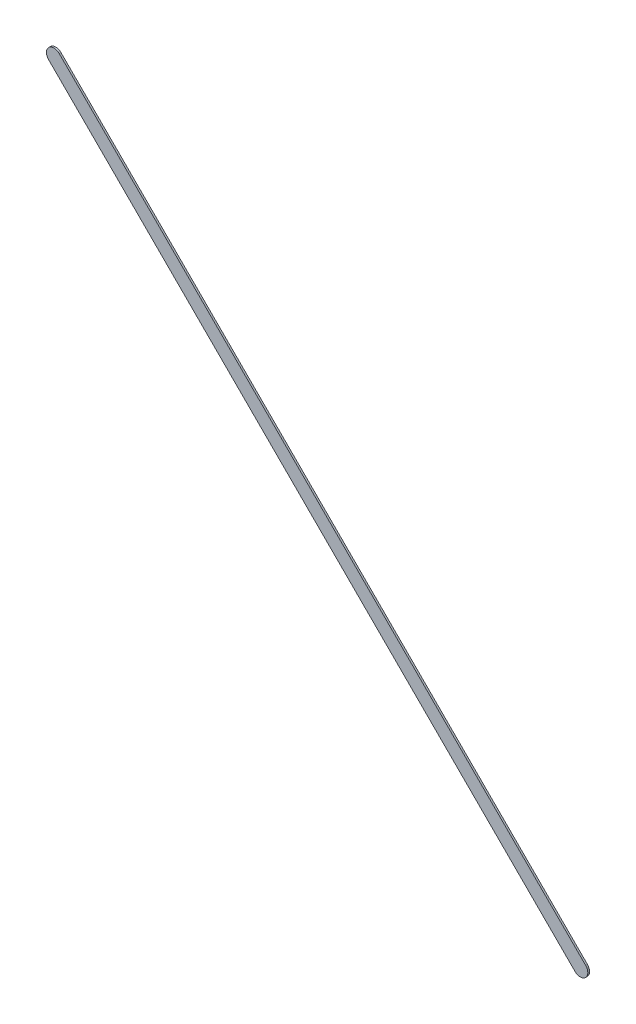
ISO-10303-21;
HEADER;
FILE_DESCRIPTION(('STEP AP214'),'2;1');
FILE_NAME('part.step','',(''),(''),'','','');
FILE_SCHEMA(('AUTOMOTIVE_DESIGN { 1 0 10303 214 1 1 1 1 }'));
ENDSEC;
DATA;
#1=APPLICATION_CONTEXT('core data for automotive mechanical design processes');
#2=APPLICATION_PROTOCOL_DEFINITION('international standard','automotive_design',2000,#1);
#3=PRODUCT_CONTEXT('',#1,'mechanical');
#4=PRODUCT('Part','Part','',(#3));
#5=PRODUCT_RELATED_PRODUCT_CATEGORY('part','',(#4));
#6=PRODUCT_DEFINITION_FORMATION('','',#4);
#7=PRODUCT_DEFINITION_CONTEXT('part definition',#1,'design');
#8=PRODUCT_DEFINITION('design','',#6,#7);
#9=PRODUCT_DEFINITION_SHAPE('','',#8);
#10=(LENGTH_UNIT() NAMED_UNIT(*) SI_UNIT(.MILLI.,.METRE.));
#11=(NAMED_UNIT(*) PLANE_ANGLE_UNIT() SI_UNIT($,.RADIAN.));
#12=(NAMED_UNIT(*) SI_UNIT($,.STERADIAN.) SOLID_ANGLE_UNIT());
#13=UNCERTAINTY_MEASURE_WITH_UNIT(LENGTH_MEASURE(1.E-05),#10,'distance_accuracy_value','');
#14=(GEOMETRIC_REPRESENTATION_CONTEXT(3) GLOBAL_UNCERTAINTY_ASSIGNED_CONTEXT((#13)) GLOBAL_UNIT_ASSIGNED_CONTEXT((#10,
#11,#12)) REPRESENTATION_CONTEXT('',''));
#15=CARTESIAN_POINT('',(0.,0.,0.));
#16=DIRECTION('',(0.,0.,1.));
#17=DIRECTION('',(1.,0.,0.));
#18=AXIS2_PLACEMENT_3D('',#15,#16,#17);
#19=CARTESIAN_POINT('',(128.393932,-81.136065,1.635));
#20=DIRECTION('',(0.,0.,1.));
#21=DIRECTION('',(1.,0.,0.));
#22=AXIS2_PLACEMENT_3D('',#19,#20,#21);
#23=PLANE('',#22);
#24=DIRECTION('',(0.707106781186548,-0.707106781186548,0.));
#25=VECTOR('',#24,1.);
#26=CARTESIAN_POINT('',(128.393932,-81.136065,1.635));
#27=LINE('',#26,#25);
#28=CARTESIAN_POINT('',(128.393932,-81.136065,1.635));
#29=VERTEX_POINT('',#28);
#30=CARTESIAN_POINT('',(138.913933,-91.656066,1.635));
#31=VERTEX_POINT('',#30);
#32=EDGE_CURVE('E86',#29,#31,#27,.T.);
#33=ORIENTED_EDGE('',*,*,#32,.T.);
#34=CARTESIAN_POINT('',(139.0199995,-91.5499995,1.635));
#35=DIRECTION('',(0.,0.,1.));
#36=DIRECTION('',(-0.707106781186548,-0.707106781186548,0.));
#37=AXIS2_PLACEMENT_3D('',#34,#35,#36);
#38=CIRCLE('',#37,0.150000682813);
#39=CARTESIAN_POINT('',(139.126066,-91.443933,1.635));
#40=VERTEX_POINT('',#39);
#41=EDGE_CURVE('E73',#31,#40,#38,.T.);
#42=ORIENTED_EDGE('',*,*,#41,.T.);
#43=DIRECTION('',(-0.707106781186548,0.707106781186548,0.));
#44=VECTOR('',#43,1.);
#45=CARTESIAN_POINT('',(139.126066,-91.443933,1.635));
#46=LINE('',#45,#44);
#47=CARTESIAN_POINT('',(128.606065,-80.923932,1.635));
#48=VERTEX_POINT('',#47);
#49=EDGE_CURVE('E21',#40,#48,#46,.T.);
#50=ORIENTED_EDGE('',*,*,#49,.T.);
#51=CARTESIAN_POINT('',(128.4999985,-81.0299985,1.635));
#52=DIRECTION('',(0.,0.,1.));
#53=DIRECTION('',(0.707106781186548,0.707106781186548,0.));
#54=AXIS2_PLACEMENT_3D('',#51,#52,#53);
#55=CIRCLE('',#54,0.150000682813);
#56=EDGE_CURVE('E11',#48,#29,#55,.T.);
#57=ORIENTED_EDGE('',*,*,#56,.T.);
#58=EDGE_LOOP('',(#33,#42,#50,#57));
#59=FACE_BOUND('',#58,.T.);
#60=ADVANCED_FACE('F17',(#59),#23,.T.);
#61=CARTESIAN_POINT('',(128.393932,-81.136065,1.6));
#62=DIRECTION('',(0.,0.,1.));
#63=DIRECTION('',(1.,0.,0.));
#64=AXIS2_PLACEMENT_3D('',#61,#62,#63);
#65=PLANE('',#64);
#66=CARTESIAN_POINT('',(128.4999985,-81.0299985,1.6));
#67=DIRECTION('',(0.,0.,1.));
#68=DIRECTION('',(0.707106781186548,0.707106781186548,0.));
#69=AXIS2_PLACEMENT_3D('',#66,#67,#68);
#70=CIRCLE('',#69,0.150000682813);
#71=CARTESIAN_POINT('',(128.606065,-80.923932,1.6));
#72=VERTEX_POINT('',#71);
#73=CARTESIAN_POINT('',(128.393932,-81.136065,1.6));
#74=VERTEX_POINT('',#73);
#75=EDGE_CURVE('E27',#72,#74,#70,.T.);
#76=ORIENTED_EDGE('',*,*,#75,.F.);
#77=DIRECTION('',(-0.707106781186548,0.707106781186548,0.));
#78=VECTOR('',#77,1.);
#79=CARTESIAN_POINT('',(139.126066,-91.443933,1.6));
#80=LINE('',#79,#78);
#81=CARTESIAN_POINT('',(139.126066,-91.443933,1.6));
#82=VERTEX_POINT('',#81);
#83=EDGE_CURVE('E84',#82,#72,#80,.T.);
#84=ORIENTED_EDGE('',*,*,#83,.F.);
#85=CARTESIAN_POINT('',(139.0199995,-91.5499995,1.6));
#86=DIRECTION('',(0.,0.,1.));
#87=DIRECTION('',(-0.707106781186548,-0.707106781186548,0.));
#88=AXIS2_PLACEMENT_3D('',#85,#86,#87);
#89=CIRCLE('',#88,0.150000682813);
#90=CARTESIAN_POINT('',(138.913933,-91.656066,1.6));
#91=VERTEX_POINT('',#90);
#92=EDGE_CURVE('E106',#91,#82,#89,.T.);
#93=ORIENTED_EDGE('',*,*,#92,.F.);
#94=DIRECTION('',(0.707106781186548,-0.707106781186548,0.));
#95=VECTOR('',#94,1.);
#96=CARTESIAN_POINT('',(128.393932,-81.136065,1.6));
#97=LINE('',#96,#95);
#98=EDGE_CURVE('E93',#74,#91,#97,.T.);
#99=ORIENTED_EDGE('',*,*,#98,.F.);
#100=EDGE_LOOP('',(#76,#84,#93,#99));
#101=FACE_BOUND('',#100,.T.);
#102=ADVANCED_FACE('F19',(#101),#65,.F.);
#103=CARTESIAN_POINT('',(128.4999985,-81.0299985,1.6));
#104=DIRECTION('',(0.,0.,-1.));
#105=DIRECTION('',(0.707106781186548,0.707106781186548,0.));
#106=AXIS2_PLACEMENT_3D('',#103,#104,#105);
#107=CYLINDRICAL_SURFACE('',#106,0.150000682813);
#108=ORIENTED_EDGE('',*,*,#75,.T.);
#109=DIRECTION('',(0.,0.,1.));
#110=VECTOR('',#109,1.);
#111=CARTESIAN_POINT('',(128.393932,-81.136065,1.6));
#112=LINE('',#111,#110);
#113=EDGE_CURVE('E90',#74,#29,#112,.T.);
#114=ORIENTED_EDGE('',*,*,#113,.T.);
#115=ORIENTED_EDGE('',*,*,#56,.F.);
#116=DIRECTION('',(0.,0.,1.));
#117=VECTOR('',#116,1.);
#118=CARTESIAN_POINT('',(128.606065,-80.923932,1.6));
#119=LINE('',#118,#117);
#120=EDGE_CURVE('E112',#72,#48,#119,.T.);
#121=ORIENTED_EDGE('',*,*,#120,.F.);
#122=EDGE_LOOP('',(#108,#114,#115,#121));
#123=FACE_BOUND('',#122,.T.);
#124=ADVANCED_FACE('F125',(#123),#107,.T.);
#125=CARTESIAN_POINT('',(139.126066,-91.443933,1.6));
#126=DIRECTION('',(-0.707106781186548,-0.707106781186548,0.));
#127=DIRECTION('',(-0.707106781186548,0.707106781186548,0.));
#128=AXIS2_PLACEMENT_3D('',#125,#126,#127);
#129=PLANE('',#128);
#130=ORIENTED_EDGE('',*,*,#83,.T.);
#131=ORIENTED_EDGE('',*,*,#120,.T.);
#132=ORIENTED_EDGE('',*,*,#49,.F.);
#133=DIRECTION('',(0.,0.,1.));
#134=VECTOR('',#133,1.);
#135=CARTESIAN_POINT('',(139.126066,-91.443933,1.6));
#136=LINE('',#135,#134);
#137=EDGE_CURVE('E81',#82,#40,#136,.T.);
#138=ORIENTED_EDGE('',*,*,#137,.F.);
#139=EDGE_LOOP('',(#130,#131,#132,#138));
#140=FACE_BOUND('',#139,.T.);
#141=ADVANCED_FACE('F123',(#140),#129,.F.);
#142=CARTESIAN_POINT('',(139.0199995,-91.5499995,1.6));
#143=DIRECTION('',(0.,0.,-1.));
#144=DIRECTION('',(-0.707106781186548,-0.707106781186548,0.));
#145=AXIS2_PLACEMENT_3D('',#142,#143,#144);
#146=CYLINDRICAL_SURFACE('',#145,0.150000682813);
#147=ORIENTED_EDGE('',*,*,#92,.T.);
#148=ORIENTED_EDGE('',*,*,#137,.T.);
#149=ORIENTED_EDGE('',*,*,#41,.F.);
#150=DIRECTION('',(0.,0.,1.));
#151=VECTOR('',#150,1.);
#152=CARTESIAN_POINT('',(138.913933,-91.656066,1.6));
#153=LINE('',#152,#151);
#154=EDGE_CURVE('E78',#91,#31,#153,.T.);
#155=ORIENTED_EDGE('',*,*,#154,.F.);
#156=EDGE_LOOP('',(#147,#148,#149,#155));
#157=FACE_BOUND('',#156,.T.);
#158=ADVANCED_FACE('F76',(#157),#146,.T.);
#159=CARTESIAN_POINT('',(128.393932,-81.136065,1.6));
#160=DIRECTION('',(0.707106781186548,0.707106781186548,0.));
#161=DIRECTION('',(0.,0.,-1.));
#162=AXIS2_PLACEMENT_3D('',#159,#160,#161);
#163=PLANE('',#162);
#164=ORIENTED_EDGE('',*,*,#98,.T.);
#165=ORIENTED_EDGE('',*,*,#154,.T.);
#166=ORIENTED_EDGE('',*,*,#32,.F.);
#167=ORIENTED_EDGE('',*,*,#113,.F.);
#168=EDGE_LOOP('',(#164,#165,#166,#167));
#169=FACE_BOUND('',#168,.T.);
#170=ADVANCED_FACE('F92',(#169),#163,.F.);
#171=CLOSED_SHELL('',(#60,#102,#124,#141,#158,#170));
#172=MANIFOLD_SOLID_BREP('B1',#171);
#173=ADVANCED_BREP_SHAPE_REPRESENTATION('',(#18,#172),#14);
#174=SHAPE_DEFINITION_REPRESENTATION(#9,#173);
ENDSEC;
END-ISO-10303-21;
